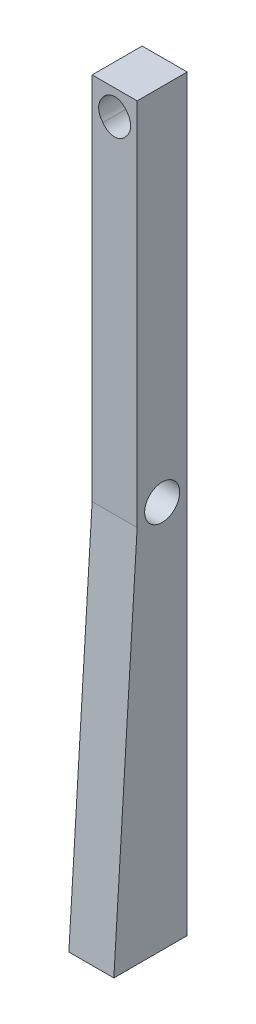
ISO-10303-21;
HEADER;
FILE_DESCRIPTION(('STEP AP214'),'2;1');
FILE_NAME('part.step','',(''),(''),'','','');
FILE_SCHEMA(('AUTOMOTIVE_DESIGN { 1 0 10303 214 1 1 1 1 }'));
ENDSEC;
DATA;
#1=APPLICATION_CONTEXT('core data for automotive mechanical design processes');
#2=APPLICATION_PROTOCOL_DEFINITION('international standard','automotive_design',2000,#1);
#3=PRODUCT_CONTEXT('',#1,'mechanical');
#4=PRODUCT('Part','Part','',(#3));
#5=PRODUCT_RELATED_PRODUCT_CATEGORY('part','',(#4));
#6=PRODUCT_DEFINITION_FORMATION('','',#4);
#7=PRODUCT_DEFINITION_CONTEXT('part definition',#1,'design');
#8=PRODUCT_DEFINITION('design','',#6,#7);
#9=PRODUCT_DEFINITION_SHAPE('','',#8);
#10=(LENGTH_UNIT() NAMED_UNIT(*) SI_UNIT(.MILLI.,.METRE.));
#11=(NAMED_UNIT(*) PLANE_ANGLE_UNIT() SI_UNIT($,.RADIAN.));
#12=(NAMED_UNIT(*) SI_UNIT($,.STERADIAN.) SOLID_ANGLE_UNIT());
#13=UNCERTAINTY_MEASURE_WITH_UNIT(LENGTH_MEASURE(1.E-05),#10,'distance_accuracy_value','');
#14=(GEOMETRIC_REPRESENTATION_CONTEXT(3) GLOBAL_UNCERTAINTY_ASSIGNED_CONTEXT((#13)) GLOBAL_UNIT_ASSIGNED_CONTEXT((#10,
#11,#12)) REPRESENTATION_CONTEXT('',''));
#15=CARTESIAN_POINT('',(0.,0.,0.));
#16=DIRECTION('',(0.,0.,1.));
#17=DIRECTION('',(1.,0.,0.));
#18=AXIS2_PLACEMENT_3D('',#15,#16,#17);
#19=CARTESIAN_POINT('',(-9.97577636792274,368.567147765925,-3.));
#20=DIRECTION('',(0.,0.,1.));
#21=DIRECTION('',(0.,1.,0.));
#22=AXIS2_PLACEMENT_3D('',#19,#20,#21);
#23=ELLIPSE('',#22,3.5,3.);
#24=DIRECTION('',(0.,0.,1.));
#25=VECTOR('',#24,1.);
#26=SURFACE_OF_LINEAR_EXTRUSION('',#23,#25);
#27=CARTESIAN_POINT('',(-9.97577636792274,368.567147765925,0.));
#28=DIRECTION('',(0.,0.,1.));
#29=DIRECTION('',(0.,1.,0.));
#30=AXIS2_PLACEMENT_3D('',#27,#28,#29);
#31=ELLIPSE('',#30,3.5,3.);
#32=CARTESIAN_POINT('',(-12.3350461376087,366.405239776707,0.));
#33=VERTEX_POINT('',#32);
#34=CARTESIAN_POINT('',(-7.61650659823679,366.405239776707,0.));
#35=VERTEX_POINT('',#34);
#36=EDGE_CURVE('E139',#33,#35,#31,.T.);
#37=ORIENTED_EDGE('',*,*,#36,.F.);
#38=DIRECTION('',(0.,0.,1.));
#39=VECTOR('',#38,1.);
#40=CARTESIAN_POINT('',(-12.3350461376087,366.405239776707,5.));
#41=LINE('',#40,#39);
#42=CARTESIAN_POINT('',(-12.3350461376087,366.405239776707,10.));
#43=VERTEX_POINT('',#42);
#44=EDGE_CURVE('E11',#33,#43,#41,.T.);
#45=ORIENTED_EDGE('',*,*,#44,.T.);
#46=CARTESIAN_POINT('',(-9.97577636792274,368.567147765925,10.));
#47=DIRECTION('',(0.,0.,1.));
#48=DIRECTION('',(0.,1.,0.));
#49=AXIS2_PLACEMENT_3D('',#46,#47,#48);
#50=ELLIPSE('',#49,3.5,3.);
#51=CARTESIAN_POINT('',(-7.61650659823679,366.405239776707,10.));
#52=VERTEX_POINT('',#51);
#53=EDGE_CURVE('E124',#43,#52,#50,.T.);
#54=ORIENTED_EDGE('',*,*,#53,.T.);
#55=DIRECTION('',(0.,0.,1.));
#56=VECTOR('',#55,1.);
#57=CARTESIAN_POINT('',(-7.61650659823678,366.405239776707,5.));
#58=LINE('',#57,#56);
#59=EDGE_CURVE('E115',#52,#35,#58,.F.);
#60=ORIENTED_EDGE('',*,*,#59,.T.);
#61=EDGE_LOOP('',(#37,#45,#54,#60));
#62=FACE_BOUND('',#61,.T.);
#63=ADVANCED_FACE('F39',(#62),#26,.F.);
#64=CARTESIAN_POINT('',(-14.4757763679227,224.004578108684,10.));
#65=DIRECTION('',(0.,1.,0.));
#66=DIRECTION('',(0.,0.,1.));
#67=AXIS2_PLACEMENT_3D('',#64,#65,#66);
#68=PLANE('',#67);
#69=DIRECTION('',(1.,0.,0.));
#70=VECTOR('',#69,1.);
#71=CARTESIAN_POINT('',(-18.4757763679227,224.004578108684,14.6591032615337));
#72=LINE('',#71,#70);
#73=CARTESIAN_POINT('',(-14.4757763679227,224.004578108684,14.6591032615337));
#74=VERTEX_POINT('',#73);
#75=CARTESIAN_POINT('',(-5.47577636792274,224.004578108684,14.6591032615337));
#76=VERTEX_POINT('',#75);
#77=EDGE_CURVE('E138',#74,#76,#72,.T.);
#78=ORIENTED_EDGE('',*,*,#77,.F.);
#79=DIRECTION('',(0.,0.,-1.));
#80=VECTOR('',#79,1.);
#81=CARTESIAN_POINT('',(-14.4757763679227,224.004578108684,10.));
#82=LINE('',#81,#80);
#83=CARTESIAN_POINT('',(-14.4757763679227,224.004578108684,0.));
#84=VERTEX_POINT('',#83);
#85=EDGE_CURVE('E174',#74,#84,#82,.T.);
#86=ORIENTED_EDGE('',*,*,#85,.T.);
#87=DIRECTION('',(1.,0.,0.));
#88=VECTOR('',#87,1.);
#89=CARTESIAN_POINT('',(-14.4757763679227,224.004578108684,0.));
#90=LINE('',#89,#88);
#91=CARTESIAN_POINT('',(-5.47577636792273,224.004578108684,0.));
#92=VERTEX_POINT('',#91);
#93=EDGE_CURVE('E147',#84,#92,#90,.T.);
#94=ORIENTED_EDGE('',*,*,#93,.T.);
#95=DIRECTION('',(0.,0.,-1.));
#96=VECTOR('',#95,1.);
#97=CARTESIAN_POINT('',(-5.47577636792273,224.004578108684,10.));
#98=LINE('',#97,#96);
#99=EDGE_CURVE('E172',#76,#92,#98,.T.);
#100=ORIENTED_EDGE('',*,*,#99,.F.);
#101=EDGE_LOOP('',(#78,#86,#94,#100));
#102=FACE_BOUND('',#101,.T.);
#103=ADVANCED_FACE('F41',(#102),#68,.F.);
#104=CARTESIAN_POINT('',(-5.47577636792274,373.567147765925,10.));
#105=DIRECTION('',(1.,0.,0.));
#106=DIRECTION('',(0.,0.,-1.));
#107=AXIS2_PLACEMENT_3D('',#104,#105,#106);
#108=PLANE('',#107);
#109=CARTESIAN_POINT('',(-5.47577636792274,301.567147765925,4.99999999999999));
#110=DIRECTION('',(1.,0.,0.));
#111=DIRECTION('',(0.,0.,-1.));
#112=AXIS2_PLACEMENT_3D('',#109,#110,#111);
#113=CIRCLE('',#112,3.5);
#114=CARTESIAN_POINT('',(-5.47577636792274,301.567147765925,1.49999999999999));
#115=VERTEX_POINT('',#114);
#116=EDGE_CURVE('E187',#115,#115,#113,.T.);
#117=ORIENTED_EDGE('',*,*,#116,.F.);
#118=EDGE_LOOP('',(#117));
#119=FACE_BOUND('',#118,.T.);
#120=DIRECTION('',(0.,-1.,0.));
#121=VECTOR('',#120,1.);
#122=CARTESIAN_POINT('',(-5.47577636792274,301.567147765925,10.));
#123=LINE('',#122,#121);
#124=CARTESIAN_POINT('',(-5.47577636792274,373.567147765925,10.));
#125=VERTEX_POINT('',#124);
#126=CARTESIAN_POINT('',(-5.47577636792274,299.664578108684,10.));
#127=VERTEX_POINT('',#126);
#128=EDGE_CURVE('E151',#125,#127,#123,.T.);
#129=ORIENTED_EDGE('',*,*,#128,.T.);
#130=DIRECTION('',(0.,-0.998109359311998,0.0614630527536064));
#131=VECTOR('',#130,1.);
#132=CARTESIAN_POINT('',(-5.47577636792274,299.664578108684,10.));
#133=LINE('',#132,#131);
#134=EDGE_CURVE('E135',#127,#76,#133,.T.);
#135=ORIENTED_EDGE('',*,*,#134,.T.);
#136=ORIENTED_EDGE('',*,*,#99,.T.);
#137=DIRECTION('',(0.,-1.,0.));
#138=VECTOR('',#137,1.);
#139=CARTESIAN_POINT('',(-5.47577636792274,373.567147765925,0.));
#140=LINE('',#139,#138);
#141=CARTESIAN_POINT('',(-5.47577636792274,373.567147765925,0.));
#142=VERTEX_POINT('',#141);
#143=EDGE_CURVE('E161',#142,#92,#140,.T.);
#144=ORIENTED_EDGE('',*,*,#143,.F.);
#145=DIRECTION('',(0.,0.,-1.));
#146=VECTOR('',#145,1.);
#147=CARTESIAN_POINT('',(-5.47577636792274,373.567147765925,10.));
#148=LINE('',#147,#146);
#149=EDGE_CURVE('E170',#125,#142,#148,.T.);
#150=ORIENTED_EDGE('',*,*,#149,.F.);
#151=EDGE_LOOP('',(#129,#135,#136,#144,#150));
#152=FACE_BOUND('',#151,.T.);
#153=ADVANCED_FACE('F199',(#119,#152),#108,.T.);
#154=CARTESIAN_POINT('',(-14.4757763679227,301.567147765925,10.));
#155=DIRECTION('',(-1.,0.,0.));
#156=DIRECTION('',(0.,0.,1.));
#157=AXIS2_PLACEMENT_3D('',#154,#155,#156);
#158=PLANE('',#157);
#159=CARTESIAN_POINT('',(-14.4757763679227,301.567147765925,4.99999999999999));
#160=DIRECTION('',(-1.,0.,0.));
#161=DIRECTION('',(0.,0.,1.));
#162=AXIS2_PLACEMENT_3D('',#159,#160,#161);
#163=CIRCLE('',#162,3.5);
#164=CARTESIAN_POINT('',(-14.4757763679227,301.567147765925,8.49999999999999));
#165=VERTEX_POINT('',#164);
#166=EDGE_CURVE('E43',#165,#165,#163,.T.);
#167=ORIENTED_EDGE('',*,*,#166,.F.);
#168=EDGE_LOOP('',(#167));
#169=FACE_BOUND('',#168,.T.);
#170=ORIENTED_EDGE('',*,*,#85,.F.);
#171=DIRECTION('',(0.,0.998109359311998,-0.0614630527536064));
#172=VECTOR('',#171,1.);
#173=CARTESIAN_POINT('',(-14.4757763679227,301.559960415491,9.88328334803729));
#174=LINE('',#173,#172);
#175=CARTESIAN_POINT('',(-14.4757763679227,299.664578108684,10.));
#176=VERTEX_POINT('',#175);
#177=EDGE_CURVE('E141',#74,#176,#174,.T.);
#178=ORIENTED_EDGE('',*,*,#177,.T.);
#179=DIRECTION('',(0.,-1.,0.));
#180=VECTOR('',#179,1.);
#181=CARTESIAN_POINT('',(-14.4757763679227,301.567147765925,10.));
#182=LINE('',#181,#180);
#183=CARTESIAN_POINT('',(-14.4757763679227,373.567147765925,10.));
#184=VERTEX_POINT('',#183);
#185=EDGE_CURVE('E148',#184,#176,#182,.T.);
#186=ORIENTED_EDGE('',*,*,#185,.F.);
#187=DIRECTION('',(0.,0.,-1.));
#188=VECTOR('',#187,1.);
#189=CARTESIAN_POINT('',(-14.4757763679227,373.567147765925,10.));
#190=LINE('',#189,#188);
#191=CARTESIAN_POINT('',(-14.4757763679227,373.567147765925,0.));
#192=VERTEX_POINT('',#191);
#193=EDGE_CURVE('E158',#184,#192,#190,.T.);
#194=ORIENTED_EDGE('',*,*,#193,.T.);
#195=DIRECTION('',(0.,1.,0.));
#196=VECTOR('',#195,1.);
#197=CARTESIAN_POINT('',(-14.4757763679227,301.567147765925,0.));
#198=LINE('',#197,#196);
#199=EDGE_CURVE('E152',#84,#192,#198,.T.);
#200=ORIENTED_EDGE('',*,*,#199,.F.);
#201=EDGE_LOOP('',(#170,#178,#186,#194,#200));
#202=FACE_BOUND('',#201,.T.);
#203=ADVANCED_FACE('F196',(#169,#202),#158,.T.);
#204=CARTESIAN_POINT('',(0.,0.,10.));
#205=DIRECTION('',(0.,0.,1.));
#206=DIRECTION('',(1.,0.,0.));
#207=AXIS2_PLACEMENT_3D('',#204,#205,#206);
#208=PLANE('',#207);
#209=CARTESIAN_POINT('',(-9.97577636792274,368.567147765925,10.));
#210=DIRECTION('',(0.,0.,1.));
#211=DIRECTION('',(1.,0.,0.));
#212=AXIS2_PLACEMENT_3D('',#209,#210,#211);
#213=CIRCLE('',#212,3.19999999999999);
#214=CARTESIAN_POINT('',(-12.3350461376087,370.729055755143,10.));
#215=VERTEX_POINT('',#214);
#216=EDGE_CURVE('E110',#215,#43,#213,.T.);
#217=ORIENTED_EDGE('',*,*,#216,.F.);
#218=CARTESIAN_POINT('',(-7.61650659823678,370.729055755143,10.));
#219=VERTEX_POINT('',#218);
#220=EDGE_CURVE('E122',#219,#215,#50,.T.);
#221=ORIENTED_EDGE('',*,*,#220,.F.);
#222=EDGE_CURVE('E63',#52,#219,#213,.T.);
#223=ORIENTED_EDGE('',*,*,#222,.F.);
#224=ORIENTED_EDGE('',*,*,#53,.F.);
#225=EDGE_LOOP('',(#217,#221,#223,#224));
#226=FACE_BOUND('',#225,.T.);
#227=ORIENTED_EDGE('',*,*,#185,.T.);
#228=DIRECTION('',(1.,0.,0.));
#229=VECTOR('',#228,1.);
#230=CARTESIAN_POINT('',(-14.4757763679227,299.664578108684,10.));
#231=LINE('',#230,#229);
#232=EDGE_CURVE('E144',#176,#127,#231,.T.);
#233=ORIENTED_EDGE('',*,*,#232,.T.);
#234=ORIENTED_EDGE('',*,*,#128,.F.);
#235=DIRECTION('',(1.,0.,0.));
#236=VECTOR('',#235,1.);
#237=CARTESIAN_POINT('',(-14.4757763679227,373.567147765925,10.));
#238=LINE('',#237,#236);
#239=EDGE_CURVE('E155',#184,#125,#238,.T.);
#240=ORIENTED_EDGE('',*,*,#239,.F.);
#241=EDGE_LOOP('',(#227,#233,#234,#240));
#242=FACE_BOUND('',#241,.T.);
#243=ADVANCED_FACE('F120',(#226,#242),#208,.T.);
#244=CARTESIAN_POINT('',(-14.4757763679227,373.567147765925,10.));
#245=DIRECTION('',(0.,1.,0.));
#246=DIRECTION('',(0.,0.,1.));
#247=AXIS2_PLACEMENT_3D('',#244,#245,#246);
#248=PLANE('',#247);
#249=DIRECTION('',(1.,0.,0.));
#250=VECTOR('',#249,1.);
#251=CARTESIAN_POINT('',(-14.4757763679227,373.567147765925,0.));
#252=LINE('',#251,#250);
#253=EDGE_CURVE('E164',#192,#142,#252,.T.);
#254=ORIENTED_EDGE('',*,*,#253,.F.);
#255=ORIENTED_EDGE('',*,*,#193,.F.);
#256=ORIENTED_EDGE('',*,*,#239,.T.);
#257=ORIENTED_EDGE('',*,*,#149,.T.);
#258=EDGE_LOOP('',(#254,#255,#256,#257));
#259=FACE_BOUND('',#258,.T.);
#260=ADVANCED_FACE('F216',(#259),#248,.T.);
#261=CARTESIAN_POINT('',(0.,0.,0.));
#262=DIRECTION('',(0.,0.,1.));
#263=DIRECTION('',(1.,0.,0.));
#264=AXIS2_PLACEMENT_3D('',#261,#262,#263);
#265=PLANE('',#264);
#266=CARTESIAN_POINT('',(-7.61650659823678,370.729055755143,0.));
#267=VERTEX_POINT('',#266);
#268=CARTESIAN_POINT('',(-12.3350461376087,370.729055755143,0.));
#269=VERTEX_POINT('',#268);
#270=EDGE_CURVE('E130',#267,#269,#31,.T.);
#271=ORIENTED_EDGE('',*,*,#270,.T.);
#272=CARTESIAN_POINT('',(-9.97577636792274,368.567147765925,0.));
#273=DIRECTION('',(0.,0.,1.));
#274=DIRECTION('',(1.,0.,0.));
#275=AXIS2_PLACEMENT_3D('',#272,#273,#274);
#276=CIRCLE('',#275,3.19999999999999);
#277=EDGE_CURVE('E55',#269,#33,#276,.T.);
#278=ORIENTED_EDGE('',*,*,#277,.T.);
#279=ORIENTED_EDGE('',*,*,#36,.T.);
#280=EDGE_CURVE('E125',#35,#267,#276,.T.);
#281=ORIENTED_EDGE('',*,*,#280,.T.);
#282=EDGE_LOOP('',(#271,#278,#279,#281));
#283=FACE_BOUND('',#282,.T.);
#284=ORIENTED_EDGE('',*,*,#93,.F.);
#285=ORIENTED_EDGE('',*,*,#199,.T.);
#286=ORIENTED_EDGE('',*,*,#253,.T.);
#287=ORIENTED_EDGE('',*,*,#143,.T.);
#288=EDGE_LOOP('',(#284,#285,#286,#287));
#289=FACE_BOUND('',#288,.T.);
#290=ADVANCED_FACE('F184',(#283,#289),#265,.F.);
#291=CARTESIAN_POINT('',(-18.4757763679227,299.664578108684,10.));
#292=DIRECTION('',(0.,0.0614630527536064,0.998109359311998));
#293=DIRECTION('',(0.,-0.998109359311998,0.0614630527536064));
#294=AXIS2_PLACEMENT_3D('',#291,#292,#293);
#295=PLANE('',#294);
#296=ORIENTED_EDGE('',*,*,#77,.T.);
#297=ORIENTED_EDGE('',*,*,#134,.F.);
#298=ORIENTED_EDGE('',*,*,#232,.F.);
#299=ORIENTED_EDGE('',*,*,#177,.F.);
#300=EDGE_LOOP('',(#296,#297,#298,#299));
#301=FACE_BOUND('',#300,.T.);
#302=ADVANCED_FACE('F208',(#301),#295,.T.);
#303=ORIENTED_EDGE('',*,*,#220,.T.);
#304=DIRECTION('',(0.,0.,1.));
#305=VECTOR('',#304,1.);
#306=CARTESIAN_POINT('',(-12.3350461376087,370.729055755143,5.));
#307=LINE('',#306,#305);
#308=EDGE_CURVE('E48',#215,#269,#307,.F.);
#309=ORIENTED_EDGE('',*,*,#308,.T.);
#310=ORIENTED_EDGE('',*,*,#270,.F.);
#311=DIRECTION('',(0.,0.,1.));
#312=VECTOR('',#311,1.);
#313=CARTESIAN_POINT('',(-7.61650659823678,370.729055755143,5.));
#314=LINE('',#313,#312);
#315=EDGE_CURVE('E128',#267,#219,#314,.T.);
#316=ORIENTED_EDGE('',*,*,#315,.T.);
#317=EDGE_LOOP('',(#303,#309,#310,#316));
#318=FACE_BOUND('',#317,.T.);
#319=ADVANCED_FACE('F127',(#318),#26,.F.);
#320=CARTESIAN_POINT('',(-9.97577636792274,368.567147765925,-3.));
#321=DIRECTION('',(0.,0.,1.));
#322=DIRECTION('',(1.,0.,0.));
#323=AXIS2_PLACEMENT_3D('',#320,#321,#322);
#324=CYLINDRICAL_SURFACE('',#323,3.19999999999999);
#325=ORIENTED_EDGE('',*,*,#222,.T.);
#326=ORIENTED_EDGE('',*,*,#315,.F.);
#327=ORIENTED_EDGE('',*,*,#280,.F.);
#328=ORIENTED_EDGE('',*,*,#59,.F.);
#329=EDGE_LOOP('',(#325,#326,#327,#328));
#330=FACE_BOUND('',#329,.T.);
#331=ADVANCED_FACE('F234',(#330),#324,.F.);
#332=ORIENTED_EDGE('',*,*,#277,.F.);
#333=ORIENTED_EDGE('',*,*,#308,.F.);
#334=ORIENTED_EDGE('',*,*,#216,.T.);
#335=ORIENTED_EDGE('',*,*,#44,.F.);
#336=EDGE_LOOP('',(#332,#333,#334,#335));
#337=FACE_BOUND('',#336,.T.);
#338=ADVANCED_FACE('F109',(#337),#324,.F.);
#339=CARTESIAN_POINT('',(-18.4757763679227,301.567147765925,4.99999999999999));
#340=DIRECTION('',(1.,0.,0.));
#341=DIRECTION('',(0.,0.,-1.));
#342=AXIS2_PLACEMENT_3D('',#339,#340,#341);
#343=CYLINDRICAL_SURFACE('',#342,3.5);
#344=ORIENTED_EDGE('',*,*,#166,.T.);
#345=EDGE_LOOP('',(#344));
#346=FACE_BOUND('',#345,.T.);
#347=ORIENTED_EDGE('',*,*,#116,.T.);
#348=EDGE_LOOP('',(#347));
#349=FACE_BOUND('',#348,.T.);
#350=ADVANCED_FACE('F194',(#346,#349),#343,.F.);
#351=CLOSED_SHELL('',(#63,#103,#153,#203,#243,#260,#290,#302,#319,#331,#338,#350));
#352=MANIFOLD_SOLID_BREP('B2',#351);
#353=ADVANCED_BREP_SHAPE_REPRESENTATION('',(#18,#352),#14);
#354=SHAPE_DEFINITION_REPRESENTATION(#9,#353);
ENDSEC;
END-ISO-10303-21;
